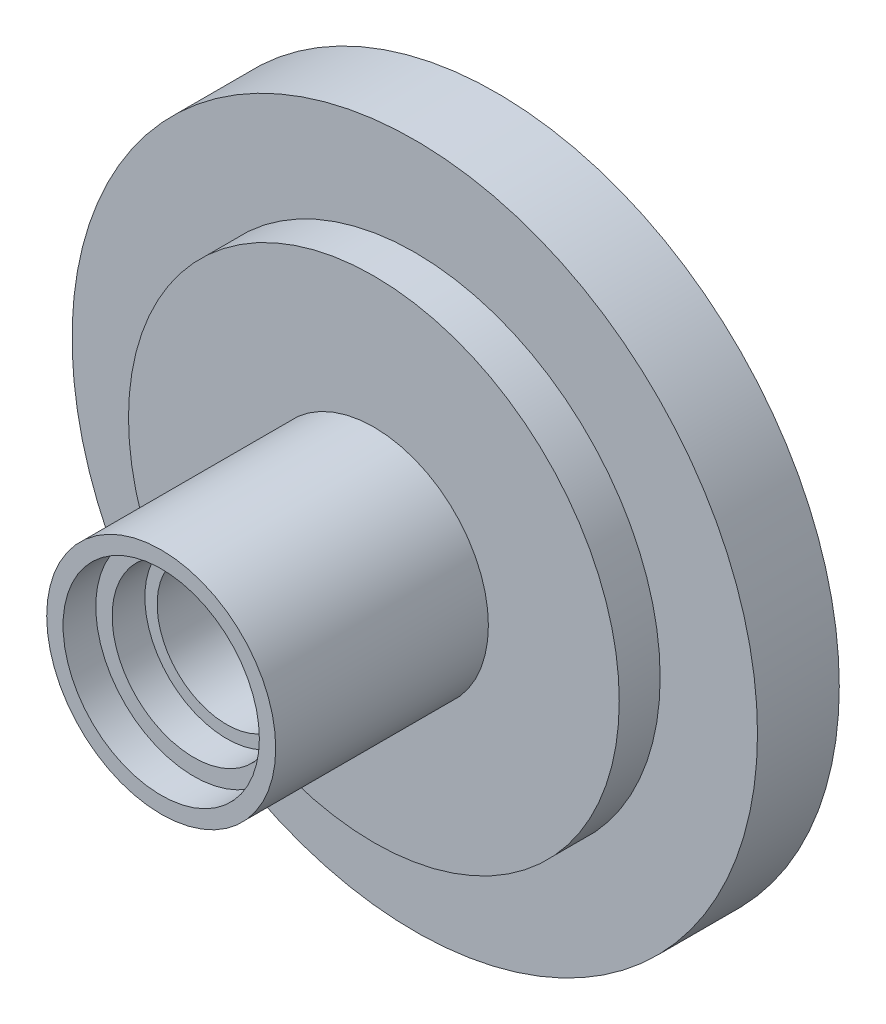
ISO-10303-21;
HEADER;
FILE_DESCRIPTION(('STEP AP214'),'2;1');
FILE_NAME('part.step','',(''),(''),'','','');
FILE_SCHEMA(('AUTOMOTIVE_DESIGN { 1 0 10303 214 1 1 1 1 }'));
ENDSEC;
DATA;
#1=APPLICATION_CONTEXT('core data for automotive mechanical design processes');
#2=APPLICATION_PROTOCOL_DEFINITION('international standard','automotive_design',2000,#1);
#3=PRODUCT_CONTEXT('',#1,'mechanical');
#4=PRODUCT('Part','Part','',(#3));
#5=PRODUCT_RELATED_PRODUCT_CATEGORY('part','',(#4));
#6=PRODUCT_DEFINITION_FORMATION('','',#4);
#7=PRODUCT_DEFINITION_CONTEXT('part definition',#1,'design');
#8=PRODUCT_DEFINITION('design','',#6,#7);
#9=PRODUCT_DEFINITION_SHAPE('','',#8);
#10=(LENGTH_UNIT() NAMED_UNIT(*) SI_UNIT(.MILLI.,.METRE.));
#11=(NAMED_UNIT(*) PLANE_ANGLE_UNIT() SI_UNIT($,.RADIAN.));
#12=(NAMED_UNIT(*) SI_UNIT($,.STERADIAN.) SOLID_ANGLE_UNIT());
#13=UNCERTAINTY_MEASURE_WITH_UNIT(LENGTH_MEASURE(1.E-05),#10,'distance_accuracy_value','');
#14=(GEOMETRIC_REPRESENTATION_CONTEXT(3) GLOBAL_UNCERTAINTY_ASSIGNED_CONTEXT((#13)) GLOBAL_UNIT_ASSIGNED_CONTEXT((#10,
#11,#12)) REPRESENTATION_CONTEXT('',''));
#15=CARTESIAN_POINT('',(0.,0.,0.));
#16=DIRECTION('',(0.,0.,1.));
#17=DIRECTION('',(1.,0.,0.));
#18=AXIS2_PLACEMENT_3D('',#15,#16,#17);
#19=CARTESIAN_POINT('',(0.,0.,0.));
#20=DIRECTION('',(0.,0.,1.));
#21=DIRECTION('',(1.,0.,0.));
#22=AXIS2_PLACEMENT_3D('',#19,#20,#21);
#23=CYLINDRICAL_SURFACE('',#22,7.);
#24=CARTESIAN_POINT('',(0.,0.,0.));
#25=DIRECTION('',(0.,0.,1.));
#26=DIRECTION('',(1.,0.,0.));
#27=AXIS2_PLACEMENT_3D('',#24,#25,#26);
#28=CIRCLE('',#27,7.);
#29=CARTESIAN_POINT('',(7.,0.,0.));
#30=VERTEX_POINT('',#29);
#31=EDGE_CURVE('E10',#30,#30,#28,.T.);
#32=ORIENTED_EDGE('',*,*,#31,.F.);
#33=EDGE_LOOP('',(#32));
#34=FACE_BOUND('',#33,.T.);
#35=CARTESIAN_POINT('',(0.,0.,-13.));
#36=DIRECTION('',(0.,0.,1.));
#37=DIRECTION('',(1.,0.,0.));
#38=AXIS2_PLACEMENT_3D('',#35,#36,#37);
#39=CIRCLE('',#38,7.);
#40=CARTESIAN_POINT('',(7.,0.,-13.));
#41=VERTEX_POINT('',#40);
#42=EDGE_CURVE('E89',#41,#41,#39,.T.);
#43=ORIENTED_EDGE('',*,*,#42,.T.);
#44=EDGE_LOOP('',(#43));
#45=FACE_BOUND('',#44,.T.);
#46=ADVANCED_FACE('F31',(#34,#45),#23,.T.);
#47=CARTESIAN_POINT('',(0.,6.,0.));
#48=DIRECTION('',(0.,0.,-1.));
#49=DIRECTION('',(-1.,0.,0.));
#50=AXIS2_PLACEMENT_3D('',#47,#48,#49);
#51=PLANE('',#50);
#52=CARTESIAN_POINT('',(0.,0.,0.));
#53=DIRECTION('',(0.,0.,1.));
#54=DIRECTION('',(1.,0.,0.));
#55=AXIS2_PLACEMENT_3D('',#52,#53,#54);
#56=CIRCLE('',#55,6.);
#57=CARTESIAN_POINT('',(6.,0.,0.));
#58=VERTEX_POINT('',#57);
#59=EDGE_CURVE('E37',#58,#58,#56,.T.);
#60=ORIENTED_EDGE('',*,*,#59,.F.);
#61=EDGE_LOOP('',(#60));
#62=FACE_BOUND('',#61,.T.);
#63=ORIENTED_EDGE('',*,*,#31,.T.);
#64=EDGE_LOOP('',(#63));
#65=FACE_BOUND('',#64,.T.);
#66=ADVANCED_FACE('F186',(#62,#65),#51,.F.);
#67=CARTESIAN_POINT('',(0.,0.,0.));
#68=DIRECTION('',(0.,0.,1.));
#69=DIRECTION('',(1.,0.,0.));
#70=AXIS2_PLACEMENT_3D('',#67,#68,#69);
#71=CYLINDRICAL_SURFACE('',#70,6.);
#72=CARTESIAN_POINT('',(0.,0.,-2.));
#73=DIRECTION('',(0.,0.,1.));
#74=DIRECTION('',(1.,0.,0.));
#75=AXIS2_PLACEMENT_3D('',#72,#73,#74);
#76=CIRCLE('',#75,6.);
#77=CARTESIAN_POINT('',(6.,0.,-2.));
#78=VERTEX_POINT('',#77);
#79=EDGE_CURVE('E41',#78,#78,#76,.T.);
#80=ORIENTED_EDGE('',*,*,#79,.F.);
#81=EDGE_LOOP('',(#80));
#82=FACE_BOUND('',#81,.T.);
#83=ORIENTED_EDGE('',*,*,#59,.T.);
#84=EDGE_LOOP('',(#83));
#85=FACE_BOUND('',#84,.T.);
#86=ADVANCED_FACE('F181',(#82,#85),#71,.F.);
#87=CARTESIAN_POINT('',(0.,6.,-2.));
#88=DIRECTION('',(0.,0.,-1.));
#89=DIRECTION('',(-1.,0.,0.));
#90=AXIS2_PLACEMENT_3D('',#87,#88,#89);
#91=PLANE('',#90);
#92=CARTESIAN_POINT('',(0.,0.,-2.));
#93=DIRECTION('',(0.,0.,1.));
#94=DIRECTION('',(1.,0.,0.));
#95=AXIS2_PLACEMENT_3D('',#92,#93,#94);
#96=CIRCLE('',#95,5.);
#97=CARTESIAN_POINT('',(5.,0.,-2.));
#98=VERTEX_POINT('',#97);
#99=EDGE_CURVE('E45',#98,#98,#96,.T.);
#100=ORIENTED_EDGE('',*,*,#99,.F.);
#101=EDGE_LOOP('',(#100));
#102=FACE_BOUND('',#101,.T.);
#103=ORIENTED_EDGE('',*,*,#79,.T.);
#104=EDGE_LOOP('',(#103));
#105=FACE_BOUND('',#104,.T.);
#106=ADVANCED_FACE('F175',(#102,#105),#91,.F.);
#107=CARTESIAN_POINT('',(0.,0.,0.));
#108=DIRECTION('',(0.,0.,1.));
#109=DIRECTION('',(1.,0.,0.));
#110=AXIS2_PLACEMENT_3D('',#107,#108,#109);
#111=CYLINDRICAL_SURFACE('',#110,5.);
#112=CARTESIAN_POINT('',(0.,0.,-4.));
#113=DIRECTION('',(0.,0.,1.));
#114=DIRECTION('',(1.,0.,0.));
#115=AXIS2_PLACEMENT_3D('',#112,#113,#114);
#116=CIRCLE('',#115,5.);
#117=CARTESIAN_POINT('',(5.,0.,-4.));
#118=VERTEX_POINT('',#117);
#119=EDGE_CURVE('E50',#118,#118,#116,.T.);
#120=ORIENTED_EDGE('',*,*,#119,.F.);
#121=EDGE_LOOP('',(#120));
#122=FACE_BOUND('',#121,.T.);
#123=ORIENTED_EDGE('',*,*,#99,.T.);
#124=EDGE_LOOP('',(#123));
#125=FACE_BOUND('',#124,.T.);
#126=ADVANCED_FACE('F169',(#122,#125),#111,.F.);
#127=CARTESIAN_POINT('',(0.,5.,-4.));
#128=DIRECTION('',(0.,0.,-1.));
#129=DIRECTION('',(-1.,0.,0.));
#130=AXIS2_PLACEMENT_3D('',#127,#128,#129);
#131=PLANE('',#130);
#132=CARTESIAN_POINT('',(0.,0.,-4.));
#133=DIRECTION('',(0.,0.,1.));
#134=DIRECTION('',(1.,0.,0.));
#135=AXIS2_PLACEMENT_3D('',#132,#133,#134);
#136=CIRCLE('',#135,4.25);
#137=CARTESIAN_POINT('',(4.25,0.,-4.));
#138=VERTEX_POINT('',#137);
#139=EDGE_CURVE('E53',#138,#138,#136,.T.);
#140=ORIENTED_EDGE('',*,*,#139,.F.);
#141=EDGE_LOOP('',(#140));
#142=FACE_BOUND('',#141,.T.);
#143=ORIENTED_EDGE('',*,*,#119,.T.);
#144=EDGE_LOOP('',(#143));
#145=FACE_BOUND('',#144,.T.);
#146=ADVANCED_FACE('F163',(#142,#145),#131,.F.);
#147=CARTESIAN_POINT('',(0.,0.,0.));
#148=DIRECTION('',(0.,0.,1.));
#149=DIRECTION('',(1.,0.,0.));
#150=AXIS2_PLACEMENT_3D('',#147,#148,#149);
#151=CYLINDRICAL_SURFACE('',#150,4.25);
#152=CARTESIAN_POINT('',(0.,0.,-24.));
#153=DIRECTION('',(0.,0.,1.));
#154=DIRECTION('',(1.,0.,0.));
#155=AXIS2_PLACEMENT_3D('',#152,#153,#154);
#156=CIRCLE('',#155,4.25);
#157=CARTESIAN_POINT('',(4.25,0.,-24.));
#158=VERTEX_POINT('',#157);
#159=EDGE_CURVE('E56',#158,#158,#156,.T.);
#160=ORIENTED_EDGE('',*,*,#159,.F.);
#161=EDGE_LOOP('',(#160));
#162=FACE_BOUND('',#161,.T.);
#163=ORIENTED_EDGE('',*,*,#139,.T.);
#164=EDGE_LOOP('',(#163));
#165=FACE_BOUND('',#164,.T.);
#166=ADVANCED_FACE('F157',(#162,#165),#151,.F.);
#167=CARTESIAN_POINT('',(0.,4.25,-24.));
#168=DIRECTION('',(0.,0.,1.));
#169=DIRECTION('',(1.,0.,0.));
#170=AXIS2_PLACEMENT_3D('',#167,#168,#169);
#171=PLANE('',#170);
#172=CARTESIAN_POINT('',(0.,0.,-24.));
#173=DIRECTION('',(0.,0.,1.));
#174=DIRECTION('',(1.,0.,0.));
#175=AXIS2_PLACEMENT_3D('',#172,#173,#174);
#176=CIRCLE('',#175,5.);
#177=CARTESIAN_POINT('',(5.,0.,-24.));
#178=VERTEX_POINT('',#177);
#179=EDGE_CURVE('E59',#178,#178,#176,.T.);
#180=ORIENTED_EDGE('',*,*,#179,.F.);
#181=EDGE_LOOP('',(#180));
#182=FACE_BOUND('',#181,.T.);
#183=ORIENTED_EDGE('',*,*,#159,.T.);
#184=EDGE_LOOP('',(#183));
#185=FACE_BOUND('',#184,.T.);
#186=ADVANCED_FACE('F151',(#182,#185),#171,.F.);
#187=CARTESIAN_POINT('',(0.,0.,0.));
#188=DIRECTION('',(0.,0.,1.));
#189=DIRECTION('',(1.,0.,0.));
#190=AXIS2_PLACEMENT_3D('',#187,#188,#189);
#191=CYLINDRICAL_SURFACE('',#190,5.);
#192=CARTESIAN_POINT('',(0.,0.,-26.));
#193=DIRECTION('',(0.,0.,1.));
#194=DIRECTION('',(1.,0.,0.));
#195=AXIS2_PLACEMENT_3D('',#192,#193,#194);
#196=CIRCLE('',#195,5.);
#197=CARTESIAN_POINT('',(5.,0.,-26.));
#198=VERTEX_POINT('',#197);
#199=EDGE_CURVE('E62',#198,#198,#196,.T.);
#200=ORIENTED_EDGE('',*,*,#199,.F.);
#201=EDGE_LOOP('',(#200));
#202=FACE_BOUND('',#201,.T.);
#203=ORIENTED_EDGE('',*,*,#179,.T.);
#204=EDGE_LOOP('',(#203));
#205=FACE_BOUND('',#204,.T.);
#206=ADVANCED_FACE('F145',(#202,#205),#191,.F.);
#207=CARTESIAN_POINT('',(0.,5.,-26.));
#208=DIRECTION('',(0.,0.,1.));
#209=DIRECTION('',(1.,0.,0.));
#210=AXIS2_PLACEMENT_3D('',#207,#208,#209);
#211=PLANE('',#210);
#212=CARTESIAN_POINT('',(0.,0.,-26.));
#213=DIRECTION('',(0.,0.,1.));
#214=DIRECTION('',(1.,0.,0.));
#215=AXIS2_PLACEMENT_3D('',#212,#213,#214);
#216=CIRCLE('',#215,6.);
#217=CARTESIAN_POINT('',(6.,0.,-26.));
#218=VERTEX_POINT('',#217);
#219=EDGE_CURVE('E65',#218,#218,#216,.T.);
#220=ORIENTED_EDGE('',*,*,#219,.F.);
#221=EDGE_LOOP('',(#220));
#222=FACE_BOUND('',#221,.T.);
#223=ORIENTED_EDGE('',*,*,#199,.T.);
#224=EDGE_LOOP('',(#223));
#225=FACE_BOUND('',#224,.T.);
#226=ADVANCED_FACE('F139',(#222,#225),#211,.F.);
#227=CARTESIAN_POINT('',(0.,0.,0.));
#228=DIRECTION('',(0.,0.,1.));
#229=DIRECTION('',(1.,0.,0.));
#230=AXIS2_PLACEMENT_3D('',#227,#228,#229);
#231=CYLINDRICAL_SURFACE('',#230,6.);
#232=CARTESIAN_POINT('',(0.,0.,-28.));
#233=DIRECTION('',(0.,0.,1.));
#234=DIRECTION('',(1.,0.,0.));
#235=AXIS2_PLACEMENT_3D('',#232,#233,#234);
#236=CIRCLE('',#235,6.);
#237=CARTESIAN_POINT('',(6.,0.,-28.));
#238=VERTEX_POINT('',#237);
#239=EDGE_CURVE('E68',#238,#238,#236,.T.);
#240=ORIENTED_EDGE('',*,*,#239,.F.);
#241=EDGE_LOOP('',(#240));
#242=FACE_BOUND('',#241,.T.);
#243=ORIENTED_EDGE('',*,*,#219,.T.);
#244=EDGE_LOOP('',(#243));
#245=FACE_BOUND('',#244,.T.);
#246=ADVANCED_FACE('F133',(#242,#245),#231,.F.);
#247=CARTESIAN_POINT('',(0.,7.,-28.));
#248=DIRECTION('',(0.,0.,1.));
#249=DIRECTION('',(1.,0.,0.));
#250=AXIS2_PLACEMENT_3D('',#247,#248,#249);
#251=PLANE('',#250);
#252=CARTESIAN_POINT('',(0.,0.,-28.));
#253=DIRECTION('',(0.,0.,1.));
#254=DIRECTION('',(1.,0.,0.));
#255=AXIS2_PLACEMENT_3D('',#252,#253,#254);
#256=CIRCLE('',#255,7.);
#257=CARTESIAN_POINT('',(7.,0.,-28.));
#258=VERTEX_POINT('',#257);
#259=EDGE_CURVE('E71',#258,#258,#256,.T.);
#260=ORIENTED_EDGE('',*,*,#259,.F.);
#261=EDGE_LOOP('',(#260));
#262=FACE_BOUND('',#261,.T.);
#263=ORIENTED_EDGE('',*,*,#239,.T.);
#264=EDGE_LOOP('',(#263));
#265=FACE_BOUND('',#264,.T.);
#266=ADVANCED_FACE('F127',(#262,#265),#251,.F.);
#267=CARTESIAN_POINT('',(0.,0.,0.));
#268=DIRECTION('',(0.,0.,1.));
#269=DIRECTION('',(1.,0.,0.));
#270=AXIS2_PLACEMENT_3D('',#267,#268,#269);
#271=CYLINDRICAL_SURFACE('',#270,7.);
#272=CARTESIAN_POINT('',(0.,0.,-20.5));
#273=DIRECTION('',(0.,0.,1.));
#274=DIRECTION('',(1.,0.,0.));
#275=AXIS2_PLACEMENT_3D('',#272,#273,#274);
#276=CIRCLE('',#275,7.);
#277=CARTESIAN_POINT('',(7.,0.,-20.5));
#278=VERTEX_POINT('',#277);
#279=EDGE_CURVE('E74',#278,#278,#276,.T.);
#280=ORIENTED_EDGE('',*,*,#279,.F.);
#281=EDGE_LOOP('',(#280));
#282=FACE_BOUND('',#281,.T.);
#283=ORIENTED_EDGE('',*,*,#259,.T.);
#284=EDGE_LOOP('',(#283));
#285=FACE_BOUND('',#284,.T.);
#286=ADVANCED_FACE('F121',(#282,#285),#271,.T.);
#287=CARTESIAN_POINT('',(0.,20.95,-20.5));
#288=DIRECTION('',(0.,0.,1.));
#289=DIRECTION('',(1.,0.,0.));
#290=AXIS2_PLACEMENT_3D('',#287,#288,#289);
#291=PLANE('',#290);
#292=CARTESIAN_POINT('',(0.,0.,-20.5));
#293=DIRECTION('',(0.,0.,1.));
#294=DIRECTION('',(1.,0.,0.));
#295=AXIS2_PLACEMENT_3D('',#292,#293,#294);
#296=CIRCLE('',#295,20.95);
#297=CARTESIAN_POINT('',(20.95,0.,-20.5));
#298=VERTEX_POINT('',#297);
#299=EDGE_CURVE('E77',#298,#298,#296,.T.);
#300=ORIENTED_EDGE('',*,*,#299,.F.);
#301=EDGE_LOOP('',(#300));
#302=FACE_BOUND('',#301,.T.);
#303=ORIENTED_EDGE('',*,*,#279,.T.);
#304=EDGE_LOOP('',(#303));
#305=FACE_BOUND('',#304,.T.);
#306=ADVANCED_FACE('F115',(#302,#305),#291,.F.);
#307=CARTESIAN_POINT('',(0.,0.,0.));
#308=DIRECTION('',(0.,0.,1.));
#309=DIRECTION('',(1.,0.,0.));
#310=AXIS2_PLACEMENT_3D('',#307,#308,#309);
#311=CYLINDRICAL_SURFACE('',#310,20.95);
#312=CARTESIAN_POINT('',(0.,0.,-15.5));
#313=DIRECTION('',(0.,0.,1.));
#314=DIRECTION('',(1.,0.,0.));
#315=AXIS2_PLACEMENT_3D('',#312,#313,#314);
#316=CIRCLE('',#315,20.95);
#317=CARTESIAN_POINT('',(20.95,0.,-15.5));
#318=VERTEX_POINT('',#317);
#319=EDGE_CURVE('E80',#318,#318,#316,.T.);
#320=ORIENTED_EDGE('',*,*,#319,.F.);
#321=EDGE_LOOP('',(#320));
#322=FACE_BOUND('',#321,.T.);
#323=ORIENTED_EDGE('',*,*,#299,.T.);
#324=EDGE_LOOP('',(#323));
#325=FACE_BOUND('',#324,.T.);
#326=ADVANCED_FACE('F109',(#322,#325),#311,.T.);
#327=CARTESIAN_POINT('',(0.,15.,-15.5));
#328=DIRECTION('',(0.,0.,-1.));
#329=DIRECTION('',(-1.,0.,0.));
#330=AXIS2_PLACEMENT_3D('',#327,#328,#329);
#331=PLANE('',#330);
#332=CARTESIAN_POINT('',(0.,0.,-15.5));
#333=DIRECTION('',(0.,0.,1.));
#334=DIRECTION('',(1.,0.,0.));
#335=AXIS2_PLACEMENT_3D('',#332,#333,#334);
#336=CIRCLE('',#335,15.);
#337=CARTESIAN_POINT('',(15.,0.,-15.5));
#338=VERTEX_POINT('',#337);
#339=EDGE_CURVE('E83',#338,#338,#336,.T.);
#340=ORIENTED_EDGE('',*,*,#339,.F.);
#341=EDGE_LOOP('',(#340));
#342=FACE_BOUND('',#341,.T.);
#343=ORIENTED_EDGE('',*,*,#319,.T.);
#344=EDGE_LOOP('',(#343));
#345=FACE_BOUND('',#344,.T.);
#346=ADVANCED_FACE('F103',(#342,#345),#331,.F.);
#347=CARTESIAN_POINT('',(0.,0.,0.));
#348=DIRECTION('',(0.,0.,1.));
#349=DIRECTION('',(1.,0.,0.));
#350=AXIS2_PLACEMENT_3D('',#347,#348,#349);
#351=CYLINDRICAL_SURFACE('',#350,15.);
#352=CARTESIAN_POINT('',(0.,0.,-13.));
#353=DIRECTION('',(0.,0.,1.));
#354=DIRECTION('',(1.,0.,0.));
#355=AXIS2_PLACEMENT_3D('',#352,#353,#354);
#356=CIRCLE('',#355,15.);
#357=CARTESIAN_POINT('',(15.,0.,-13.));
#358=VERTEX_POINT('',#357);
#359=EDGE_CURVE('E86',#358,#358,#356,.T.);
#360=ORIENTED_EDGE('',*,*,#359,.F.);
#361=EDGE_LOOP('',(#360));
#362=FACE_BOUND('',#361,.T.);
#363=ORIENTED_EDGE('',*,*,#339,.T.);
#364=EDGE_LOOP('',(#363));
#365=FACE_BOUND('',#364,.T.);
#366=ADVANCED_FACE('F97',(#362,#365),#351,.T.);
#367=CARTESIAN_POINT('',(0.,7.,-13.));
#368=DIRECTION('',(0.,0.,-1.));
#369=DIRECTION('',(-1.,0.,0.));
#370=AXIS2_PLACEMENT_3D('',#367,#368,#369);
#371=PLANE('',#370);
#372=ORIENTED_EDGE('',*,*,#42,.F.);
#373=EDGE_LOOP('',(#372));
#374=FACE_BOUND('',#373,.T.);
#375=ORIENTED_EDGE('',*,*,#359,.T.);
#376=EDGE_LOOP('',(#375));
#377=FACE_BOUND('',#376,.T.);
#378=ADVANCED_FACE('F94',(#374,#377),#371,.F.);
#379=CLOSED_SHELL('',(#46,#66,#86,#106,#126,#146,#166,#186,#206,#226,#246,#266,#286,#306,#326,
#346,#366,#378));
#380=MANIFOLD_SOLID_BREP('B2',#379);
#381=ADVANCED_BREP_SHAPE_REPRESENTATION('',(#18,#380),#14);
#382=SHAPE_DEFINITION_REPRESENTATION(#9,#381);
ENDSEC;
END-ISO-10303-21;
